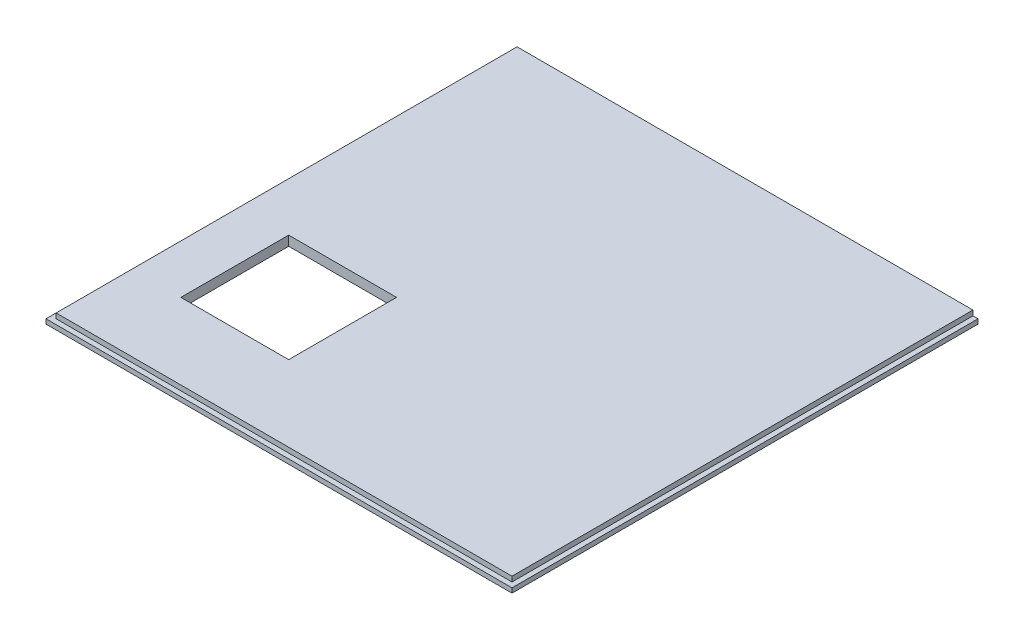
ISO-10303-21;
HEADER;
FILE_DESCRIPTION(('STEP AP214'),'2;1');
FILE_NAME('part.step','',(''),(''),'','','');
FILE_SCHEMA(('AUTOMOTIVE_DESIGN { 1 0 10303 214 1 1 1 1 }'));
ENDSEC;
DATA;
#1=APPLICATION_CONTEXT('core data for automotive mechanical design processes');
#2=APPLICATION_PROTOCOL_DEFINITION('international standard','automotive_design',2000,#1);
#3=PRODUCT_CONTEXT('',#1,'mechanical');
#4=PRODUCT('Part','Part','',(#3));
#5=PRODUCT_RELATED_PRODUCT_CATEGORY('part','',(#4));
#6=PRODUCT_DEFINITION_FORMATION('','',#4);
#7=PRODUCT_DEFINITION_CONTEXT('part definition',#1,'design');
#8=PRODUCT_DEFINITION('design','',#6,#7);
#9=PRODUCT_DEFINITION_SHAPE('','',#8);
#10=(LENGTH_UNIT() NAMED_UNIT(*) SI_UNIT(.MILLI.,.METRE.));
#11=(NAMED_UNIT(*) PLANE_ANGLE_UNIT() SI_UNIT($,.RADIAN.));
#12=(NAMED_UNIT(*) SI_UNIT($,.STERADIAN.) SOLID_ANGLE_UNIT());
#13=UNCERTAINTY_MEASURE_WITH_UNIT(LENGTH_MEASURE(1.E-05),#10,'distance_accuracy_value','');
#14=(GEOMETRIC_REPRESENTATION_CONTEXT(3) GLOBAL_UNCERTAINTY_ASSIGNED_CONTEXT((#13)) GLOBAL_UNIT_ASSIGNED_CONTEXT((#10,
#11,#12)) REPRESENTATION_CONTEXT('',''));
#15=CARTESIAN_POINT('',(0.,0.,0.));
#16=DIRECTION('',(0.,0.,1.));
#17=DIRECTION('',(1.,0.,0.));
#18=AXIS2_PLACEMENT_3D('',#15,#16,#17);
#19=CARTESIAN_POINT('',(0.,18.25625,83.3437499999999));
#20=DIRECTION('',(0.,0.,-1.));
#21=DIRECTION('',(-1.,0.,0.));
#22=AXIS2_PLACEMENT_3D('',#19,#20,#21);
#23=PLANE('',#22);
#24=DIRECTION('',(1.,0.,0.));
#25=VECTOR('',#24,1.);
#26=CARTESIAN_POINT('',(0.,0.,83.3437499999999));
#27=LINE('',#26,#25);
#28=CARTESIAN_POINT('',(-337.34375,0.,83.3437499999999));
#29=VERTEX_POINT('',#28);
#30=CARTESIAN_POINT('',(-134.14375,0.,83.3437499999999));
#31=VERTEX_POINT('',#30);
#32=EDGE_CURVE('E191',#29,#31,#27,.T.);
#33=ORIENTED_EDGE('',*,*,#32,.T.);
#34=DIRECTION('',(0.,-1.,0.));
#35=VECTOR('',#34,1.);
#36=CARTESIAN_POINT('',(-134.14375,18.25625,83.3437499999999));
#37=LINE('',#36,#35);
#38=CARTESIAN_POINT('',(-134.14375,18.25625,83.3437499999999));
#39=VERTEX_POINT('',#38);
#40=EDGE_CURVE('E11',#39,#31,#37,.T.);
#41=ORIENTED_EDGE('',*,*,#40,.F.);
#42=DIRECTION('',(1.,0.,0.));
#43=VECTOR('',#42,1.);
#44=CARTESIAN_POINT('',(0.,18.25625,83.3437499999999));
#45=LINE('',#44,#43);
#46=CARTESIAN_POINT('',(-337.34375,18.25625,83.3437499999999));
#47=VERTEX_POINT('',#46);
#48=EDGE_CURVE('E208',#47,#39,#45,.T.);
#49=ORIENTED_EDGE('',*,*,#48,.F.);
#50=DIRECTION('',(0.,-1.,0.));
#51=VECTOR('',#50,1.);
#52=CARTESIAN_POINT('',(-337.34375,18.25625,83.3437499999999));
#53=LINE('',#52,#51);
#54=EDGE_CURVE('E60',#47,#29,#53,.T.);
#55=ORIENTED_EDGE('',*,*,#54,.T.);
#56=EDGE_LOOP('',(#33,#41,#49,#55));
#57=FACE_BOUND('',#56,.T.);
#58=ADVANCED_FACE('F34',(#57),#23,.F.);
#59=CARTESIAN_POINT('',(-134.14375,18.25625,0.));
#60=DIRECTION('',(1.,0.,0.));
#61=DIRECTION('',(0.,0.,-1.));
#62=AXIS2_PLACEMENT_3D('',#59,#60,#61);
#63=PLANE('',#62);
#64=DIRECTION('',(0.,0.,1.));
#65=VECTOR('',#64,1.);
#66=CARTESIAN_POINT('',(-134.14375,0.,0.));
#67=LINE('',#66,#65);
#68=CARTESIAN_POINT('',(-134.14375,0.,286.54375));
#69=VERTEX_POINT('',#68);
#70=EDGE_CURVE('E187',#31,#69,#67,.T.);
#71=ORIENTED_EDGE('',*,*,#70,.T.);
#72=DIRECTION('',(0.,-1.,0.));
#73=VECTOR('',#72,1.);
#74=CARTESIAN_POINT('',(-134.14375,18.25625,286.54375));
#75=LINE('',#74,#73);
#76=CARTESIAN_POINT('',(-134.14375,18.25625,286.54375));
#77=VERTEX_POINT('',#76);
#78=EDGE_CURVE('E43',#77,#69,#75,.T.);
#79=ORIENTED_EDGE('',*,*,#78,.F.);
#80=DIRECTION('',(0.,0.,1.));
#81=VECTOR('',#80,1.);
#82=CARTESIAN_POINT('',(-134.14375,18.25625,0.));
#83=LINE('',#82,#81);
#84=EDGE_CURVE('E98',#39,#77,#83,.T.);
#85=ORIENTED_EDGE('',*,*,#84,.F.);
#86=ORIENTED_EDGE('',*,*,#40,.T.);
#87=EDGE_LOOP('',(#71,#79,#85,#86));
#88=FACE_BOUND('',#87,.T.);
#89=ADVANCED_FACE('F188',(#88),#63,.F.);
#90=CARTESIAN_POINT('',(0.,18.25625,286.54375));
#91=DIRECTION('',(0.,0.,-1.));
#92=DIRECTION('',(-1.,0.,0.));
#93=AXIS2_PLACEMENT_3D('',#90,#91,#92);
#94=PLANE('',#93);
#95=DIRECTION('',(1.,0.,0.));
#96=VECTOR('',#95,1.);
#97=CARTESIAN_POINT('',(0.,0.,286.54375));
#98=LINE('',#97,#96);
#99=CARTESIAN_POINT('',(-337.34375,0.,286.54375));
#100=VERTEX_POINT('',#99);
#101=EDGE_CURVE('E184',#100,#69,#98,.T.);
#102=ORIENTED_EDGE('',*,*,#101,.F.);
#103=DIRECTION('',(0.,-1.,0.));
#104=VECTOR('',#103,1.);
#105=CARTESIAN_POINT('',(-337.34375,18.25625,286.54375));
#106=LINE('',#105,#104);
#107=CARTESIAN_POINT('',(-337.34375,18.25625,286.54375));
#108=VERTEX_POINT('',#107);
#109=EDGE_CURVE('E172',#108,#100,#106,.T.);
#110=ORIENTED_EDGE('',*,*,#109,.F.);
#111=DIRECTION('',(1.,0.,0.));
#112=VECTOR('',#111,1.);
#113=CARTESIAN_POINT('',(0.,18.25625,286.54375));
#114=LINE('',#113,#112);
#115=EDGE_CURVE('E162',#108,#77,#114,.T.);
#116=ORIENTED_EDGE('',*,*,#115,.T.);
#117=ORIENTED_EDGE('',*,*,#78,.T.);
#118=EDGE_LOOP('',(#102,#110,#116,#117));
#119=FACE_BOUND('',#118,.T.);
#120=ADVANCED_FACE('F182',(#119),#94,.T.);
#121=CARTESIAN_POINT('',(0.,18.25625,438.94375));
#122=DIRECTION('',(0.,0.,-1.));
#123=DIRECTION('',(-1.,0.,0.));
#124=AXIS2_PLACEMENT_3D('',#121,#122,#123);
#125=PLANE('',#124);
#126=DIRECTION('',(0.,-1.,0.));
#127=VECTOR('',#126,1.);
#128=CARTESIAN_POINT('',(438.94375,18.25625,438.94375));
#129=LINE('',#128,#127);
#130=CARTESIAN_POINT('',(438.94375,8.73125,438.94375));
#131=VERTEX_POINT('',#130);
#132=CARTESIAN_POINT('',(438.94375,0.,438.94375));
#133=VERTEX_POINT('',#132);
#134=EDGE_CURVE('E38',#131,#133,#129,.T.);
#135=ORIENTED_EDGE('',*,*,#134,.F.);
#136=DIRECTION('',(1.,0.,0.));
#137=VECTOR('',#136,1.);
#138=CARTESIAN_POINT('',(438.94375,8.73125,438.94375));
#139=LINE('',#138,#137);
#140=CARTESIAN_POINT('',(-438.94375,8.73125,438.94375));
#141=VERTEX_POINT('',#140);
#142=EDGE_CURVE('E136',#141,#131,#139,.T.);
#143=ORIENTED_EDGE('',*,*,#142,.F.);
#144=DIRECTION('',(0.,-1.,0.));
#145=VECTOR('',#144,1.);
#146=CARTESIAN_POINT('',(-438.94375,18.25625,438.94375));
#147=LINE('',#146,#145);
#148=CARTESIAN_POINT('',(-438.94375,0.,438.94375));
#149=VERTEX_POINT('',#148);
#150=EDGE_CURVE('E149',#141,#149,#147,.T.);
#151=ORIENTED_EDGE('',*,*,#150,.T.);
#152=DIRECTION('',(1.,0.,0.));
#153=VECTOR('',#152,1.);
#154=CARTESIAN_POINT('',(0.,0.,438.94375));
#155=LINE('',#154,#153);
#156=EDGE_CURVE('E203',#149,#133,#155,.T.);
#157=ORIENTED_EDGE('',*,*,#156,.T.);
#158=EDGE_LOOP('',(#135,#143,#151,#157));
#159=FACE_BOUND('',#158,.T.);
#160=ADVANCED_FACE('F36',(#159),#125,.F.);
#161=CARTESIAN_POINT('',(438.94375,18.25625,0.));
#162=DIRECTION('',(-1.,0.,0.));
#163=DIRECTION('',(0.,0.,1.));
#164=AXIS2_PLACEMENT_3D('',#161,#162,#163);
#165=PLANE('',#164);
#166=DIRECTION('',(0.,-1.,0.));
#167=VECTOR('',#166,1.);
#168=CARTESIAN_POINT('',(438.94375,18.25625,-438.94375));
#169=LINE('',#168,#167);
#170=CARTESIAN_POINT('',(438.94375,8.73125,-438.94375));
#171=VERTEX_POINT('',#170);
#172=CARTESIAN_POINT('',(438.94375,0.,-438.94375));
#173=VERTEX_POINT('',#172);
#174=EDGE_CURVE('E160',#171,#173,#169,.T.);
#175=ORIENTED_EDGE('',*,*,#174,.F.);
#176=DIRECTION('',(0.,0.,-1.));
#177=VECTOR('',#176,1.);
#178=CARTESIAN_POINT('',(438.94375,8.73125,-438.94375));
#179=LINE('',#178,#177);
#180=EDGE_CURVE('E151',#131,#171,#179,.T.);
#181=ORIENTED_EDGE('',*,*,#180,.F.);
#182=ORIENTED_EDGE('',*,*,#134,.T.);
#183=DIRECTION('',(0.,0.,-1.));
#184=VECTOR('',#183,1.);
#185=CARTESIAN_POINT('',(438.94375,0.,0.));
#186=LINE('',#185,#184);
#187=EDGE_CURVE('E201',#133,#173,#186,.T.);
#188=ORIENTED_EDGE('',*,*,#187,.T.);
#189=EDGE_LOOP('',(#175,#181,#182,#188));
#190=FACE_BOUND('',#189,.T.);
#191=ADVANCED_FACE('F238',(#190),#165,.F.);
#192=CARTESIAN_POINT('',(0.,18.25625,-438.94375));
#193=DIRECTION('',(0.,0.,-1.));
#194=DIRECTION('',(-1.,0.,0.));
#195=AXIS2_PLACEMENT_3D('',#192,#193,#194);
#196=PLANE('',#195);
#197=DIRECTION('',(0.,1.,0.));
#198=VECTOR('',#197,1.);
#199=CARTESIAN_POINT('',(429.41875,8.73125,-438.94375));
#200=LINE('',#199,#198);
#201=CARTESIAN_POINT('',(429.41875,8.73125,-438.94375));
#202=VERTEX_POINT('',#201);
#203=CARTESIAN_POINT('',(429.41875,18.25625,-438.94375));
#204=VERTEX_POINT('',#203);
#205=EDGE_CURVE('E51',#202,#204,#200,.T.);
#206=ORIENTED_EDGE('',*,*,#205,.F.);
#207=DIRECTION('',(-1.,0.,0.));
#208=VECTOR('',#207,1.);
#209=CARTESIAN_POINT('',(429.41875,8.73125,-438.94375));
#210=LINE('',#209,#208);
#211=EDGE_CURVE('E234',#171,#202,#210,.T.);
#212=ORIENTED_EDGE('',*,*,#211,.F.);
#213=ORIENTED_EDGE('',*,*,#174,.T.);
#214=DIRECTION('',(1.,0.,0.));
#215=VECTOR('',#214,1.);
#216=CARTESIAN_POINT('',(0.,0.,-438.94375));
#217=LINE('',#216,#215);
#218=CARTESIAN_POINT('',(-438.94375,0.,-438.94375));
#219=VERTEX_POINT('',#218);
#220=EDGE_CURVE('E198',#219,#173,#217,.T.);
#221=ORIENTED_EDGE('',*,*,#220,.F.);
#222=DIRECTION('',(0.,-1.,0.));
#223=VECTOR('',#222,1.);
#224=CARTESIAN_POINT('',(-438.94375,18.25625,-438.94375));
#225=LINE('',#224,#223);
#226=CARTESIAN_POINT('',(-438.94375,8.73125,-438.94375));
#227=VERTEX_POINT('',#226);
#228=EDGE_CURVE('E157',#227,#219,#225,.T.);
#229=ORIENTED_EDGE('',*,*,#228,.F.);
#230=DIRECTION('',(-1.,0.,0.));
#231=VECTOR('',#230,1.);
#232=CARTESIAN_POINT('',(-429.41875,8.73125,-438.94375));
#233=LINE('',#232,#231);
#234=CARTESIAN_POINT('',(-429.41875,8.73125,-438.94375));
#235=VERTEX_POINT('',#234);
#236=EDGE_CURVE('E140',#235,#227,#233,.T.);
#237=ORIENTED_EDGE('',*,*,#236,.F.);
#238=DIRECTION('',(0.,1.,0.));
#239=VECTOR('',#238,1.);
#240=CARTESIAN_POINT('',(-429.41875,8.73125,-438.94375));
#241=LINE('',#240,#239);
#242=CARTESIAN_POINT('',(-429.41875,18.25625,-438.94375));
#243=VERTEX_POINT('',#242);
#244=EDGE_CURVE('E204',#235,#243,#241,.T.);
#245=ORIENTED_EDGE('',*,*,#244,.T.);
#246=DIRECTION('',(1.,0.,0.));
#247=VECTOR('',#246,1.);
#248=CARTESIAN_POINT('',(0.,18.25625,-438.94375));
#249=LINE('',#248,#247);
#250=EDGE_CURVE('E194',#243,#204,#249,.T.);
#251=ORIENTED_EDGE('',*,*,#250,.T.);
#252=EDGE_LOOP('',(#206,#212,#213,#221,#229,#237,#245,#251));
#253=FACE_BOUND('',#252,.T.);
#254=ADVANCED_FACE('F237',(#253),#196,.T.);
#255=CARTESIAN_POINT('',(-438.94375,18.25625,0.));
#256=DIRECTION('',(-1.,0.,0.));
#257=DIRECTION('',(0.,0.,1.));
#258=AXIS2_PLACEMENT_3D('',#255,#256,#257);
#259=PLANE('',#258);
#260=DIRECTION('',(0.,0.,1.));
#261=VECTOR('',#260,1.);
#262=CARTESIAN_POINT('',(-438.94375,8.73125,-438.94375));
#263=LINE('',#262,#261);
#264=EDGE_CURVE('E133',#227,#141,#263,.T.);
#265=ORIENTED_EDGE('',*,*,#264,.F.);
#266=ORIENTED_EDGE('',*,*,#228,.T.);
#267=DIRECTION('',(0.,0.,-1.));
#268=VECTOR('',#267,1.);
#269=CARTESIAN_POINT('',(-438.94375,0.,0.));
#270=LINE('',#269,#268);
#271=EDGE_CURVE('E156',#149,#219,#270,.T.);
#272=ORIENTED_EDGE('',*,*,#271,.F.);
#273=ORIENTED_EDGE('',*,*,#150,.F.);
#274=EDGE_LOOP('',(#265,#266,#272,#273));
#275=FACE_BOUND('',#274,.T.);
#276=ADVANCED_FACE('F154',(#275),#259,.T.);
#277=CARTESIAN_POINT('',(-337.34375,18.25625,0.));
#278=DIRECTION('',(1.,0.,0.));
#279=DIRECTION('',(0.,0.,-1.));
#280=AXIS2_PLACEMENT_3D('',#277,#278,#279);
#281=PLANE('',#280);
#282=DIRECTION('',(0.,0.,1.));
#283=VECTOR('',#282,1.);
#284=CARTESIAN_POINT('',(-337.34375,0.,0.));
#285=LINE('',#284,#283);
#286=EDGE_CURVE('E176',#29,#100,#285,.T.);
#287=ORIENTED_EDGE('',*,*,#286,.F.);
#288=ORIENTED_EDGE('',*,*,#54,.F.);
#289=DIRECTION('',(0.,0.,1.));
#290=VECTOR('',#289,1.);
#291=CARTESIAN_POINT('',(-337.34375,18.25625,0.));
#292=LINE('',#291,#290);
#293=EDGE_CURVE('E158',#47,#108,#292,.T.);
#294=ORIENTED_EDGE('',*,*,#293,.T.);
#295=ORIENTED_EDGE('',*,*,#109,.T.);
#296=EDGE_LOOP('',(#287,#288,#294,#295));
#297=FACE_BOUND('',#296,.T.);
#298=ADVANCED_FACE('F272',(#297),#281,.T.);
#299=CARTESIAN_POINT('',(0.,18.25625,0.));
#300=DIRECTION('',(0.,1.,0.));
#301=DIRECTION('',(0.,0.,1.));
#302=AXIS2_PLACEMENT_3D('',#299,#300,#301);
#303=PLANE('',#302);
#304=DIRECTION('',(0.,0.,-1.));
#305=VECTOR('',#304,1.);
#306=CARTESIAN_POINT('',(-429.41875,18.25625,-438.94375));
#307=LINE('',#306,#305);
#308=CARTESIAN_POINT('',(-429.41875,18.25625,429.41875));
#309=VERTEX_POINT('',#308);
#310=EDGE_CURVE('E144',#309,#243,#307,.T.);
#311=ORIENTED_EDGE('',*,*,#310,.F.);
#312=DIRECTION('',(-1.,0.,0.));
#313=VECTOR('',#312,1.);
#314=CARTESIAN_POINT('',(-429.41875,18.25625,429.41875));
#315=LINE('',#314,#313);
#316=CARTESIAN_POINT('',(429.41875,18.25625,429.41875));
#317=VERTEX_POINT('',#316);
#318=EDGE_CURVE('E220',#317,#309,#315,.T.);
#319=ORIENTED_EDGE('',*,*,#318,.F.);
#320=DIRECTION('',(0.,0.,1.));
#321=VECTOR('',#320,1.);
#322=CARTESIAN_POINT('',(429.41875,18.25625,429.41875));
#323=LINE('',#322,#321);
#324=EDGE_CURVE('E223',#204,#317,#323,.T.);
#325=ORIENTED_EDGE('',*,*,#324,.F.);
#326=ORIENTED_EDGE('',*,*,#250,.F.);
#327=EDGE_LOOP('',(#311,#319,#325,#326));
#328=FACE_BOUND('',#327,.T.);
#329=ORIENTED_EDGE('',*,*,#48,.T.);
#330=ORIENTED_EDGE('',*,*,#84,.T.);
#331=ORIENTED_EDGE('',*,*,#115,.F.);
#332=ORIENTED_EDGE('',*,*,#293,.F.);
#333=EDGE_LOOP('',(#329,#330,#331,#332));
#334=FACE_BOUND('',#333,.T.);
#335=ADVANCED_FACE('F245',(#328,#334),#303,.T.);
#336=CARTESIAN_POINT('',(0.,0.,0.));
#337=DIRECTION('',(0.,1.,0.));
#338=DIRECTION('',(0.,0.,1.));
#339=AXIS2_PLACEMENT_3D('',#336,#337,#338);
#340=PLANE('',#339);
#341=ORIENTED_EDGE('',*,*,#156,.F.);
#342=ORIENTED_EDGE('',*,*,#271,.T.);
#343=ORIENTED_EDGE('',*,*,#220,.T.);
#344=ORIENTED_EDGE('',*,*,#187,.F.);
#345=EDGE_LOOP('',(#341,#342,#343,#344));
#346=FACE_BOUND('',#345,.T.);
#347=ORIENTED_EDGE('',*,*,#32,.F.);
#348=ORIENTED_EDGE('',*,*,#286,.T.);
#349=ORIENTED_EDGE('',*,*,#101,.T.);
#350=ORIENTED_EDGE('',*,*,#70,.F.);
#351=EDGE_LOOP('',(#347,#348,#349,#350));
#352=FACE_BOUND('',#351,.T.);
#353=ADVANCED_FACE('F193',(#346,#352),#340,.F.);
#354=CARTESIAN_POINT('',(-429.41875,8.73125,-438.94375));
#355=DIRECTION('',(1.,0.,0.));
#356=DIRECTION('',(0.,0.,-1.));
#357=AXIS2_PLACEMENT_3D('',#354,#355,#356);
#358=PLANE('',#357);
#359=ORIENTED_EDGE('',*,*,#310,.T.);
#360=ORIENTED_EDGE('',*,*,#244,.F.);
#361=DIRECTION('',(0.,0.,-1.));
#362=VECTOR('',#361,1.);
#363=CARTESIAN_POINT('',(-429.41875,8.73125,-438.94375));
#364=LINE('',#363,#362);
#365=CARTESIAN_POINT('',(-429.41875,8.73125,429.41875));
#366=VERTEX_POINT('',#365);
#367=EDGE_CURVE('E226',#366,#235,#364,.T.);
#368=ORIENTED_EDGE('',*,*,#367,.F.);
#369=DIRECTION('',(0.,1.,0.));
#370=VECTOR('',#369,1.);
#371=CARTESIAN_POINT('',(-429.41875,8.73125,429.41875));
#372=LINE('',#371,#370);
#373=EDGE_CURVE('E215',#366,#309,#372,.T.);
#374=ORIENTED_EDGE('',*,*,#373,.T.);
#375=EDGE_LOOP('',(#359,#360,#368,#374));
#376=FACE_BOUND('',#375,.T.);
#377=ADVANCED_FACE('F252',(#376),#358,.F.);
#378=CARTESIAN_POINT('',(-429.41875,8.73125,429.41875));
#379=DIRECTION('',(0.,0.,-1.));
#380=DIRECTION('',(-1.,0.,0.));
#381=AXIS2_PLACEMENT_3D('',#378,#379,#380);
#382=PLANE('',#381);
#383=ORIENTED_EDGE('',*,*,#318,.T.);
#384=ORIENTED_EDGE('',*,*,#373,.F.);
#385=DIRECTION('',(-1.,0.,0.));
#386=VECTOR('',#385,1.);
#387=CARTESIAN_POINT('',(-429.41875,8.73125,429.41875));
#388=LINE('',#387,#386);
#389=CARTESIAN_POINT('',(429.41875,8.73125,429.41875));
#390=VERTEX_POINT('',#389);
#391=EDGE_CURVE('E228',#390,#366,#388,.T.);
#392=ORIENTED_EDGE('',*,*,#391,.F.);
#393=DIRECTION('',(0.,1.,0.));
#394=VECTOR('',#393,1.);
#395=CARTESIAN_POINT('',(429.41875,8.73125,429.41875));
#396=LINE('',#395,#394);
#397=EDGE_CURVE('E213',#390,#317,#396,.T.);
#398=ORIENTED_EDGE('',*,*,#397,.T.);
#399=EDGE_LOOP('',(#383,#384,#392,#398));
#400=FACE_BOUND('',#399,.T.);
#401=ADVANCED_FACE('F251',(#400),#382,.F.);
#402=CARTESIAN_POINT('',(429.41875,8.73125,429.41875));
#403=DIRECTION('',(-1.,0.,0.));
#404=DIRECTION('',(0.,0.,1.));
#405=AXIS2_PLACEMENT_3D('',#402,#403,#404);
#406=PLANE('',#405);
#407=ORIENTED_EDGE('',*,*,#324,.T.);
#408=ORIENTED_EDGE('',*,*,#397,.F.);
#409=DIRECTION('',(0.,0.,1.));
#410=VECTOR('',#409,1.);
#411=CARTESIAN_POINT('',(429.41875,8.73125,429.41875));
#412=LINE('',#411,#410);
#413=EDGE_CURVE('E231',#202,#390,#412,.T.);
#414=ORIENTED_EDGE('',*,*,#413,.F.);
#415=ORIENTED_EDGE('',*,*,#205,.T.);
#416=EDGE_LOOP('',(#407,#408,#414,#415));
#417=FACE_BOUND('',#416,.T.);
#418=ADVANCED_FACE('F248',(#417),#406,.F.);
#419=CARTESIAN_POINT('',(0.,8.73125,0.));
#420=DIRECTION('',(0.,-1.,0.));
#421=DIRECTION('',(0.,0.,-1.));
#422=AXIS2_PLACEMENT_3D('',#419,#420,#421);
#423=PLANE('',#422);
#424=ORIENTED_EDGE('',*,*,#264,.T.);
#425=ORIENTED_EDGE('',*,*,#142,.T.);
#426=ORIENTED_EDGE('',*,*,#180,.T.);
#427=ORIENTED_EDGE('',*,*,#211,.T.);
#428=ORIENTED_EDGE('',*,*,#413,.T.);
#429=ORIENTED_EDGE('',*,*,#391,.T.);
#430=ORIENTED_EDGE('',*,*,#367,.T.);
#431=ORIENTED_EDGE('',*,*,#236,.T.);
#432=EDGE_LOOP('',(#424,#425,#426,#427,#428,#429,#430,#431));
#433=FACE_BOUND('',#432,.T.);
#434=ADVANCED_FACE('F135',(#433),#423,.F.);
#435=CLOSED_SHELL('',(#58,#89,#120,#160,#191,#254,#276,#298,#335,#353,#377,#401,#418,#434));
#436=MANIFOLD_SOLID_BREP('B2',#435);
#437=ADVANCED_BREP_SHAPE_REPRESENTATION('',(#18,#436),#14);
#438=SHAPE_DEFINITION_REPRESENTATION(#9,#437);
ENDSEC;
END-ISO-10303-21;
